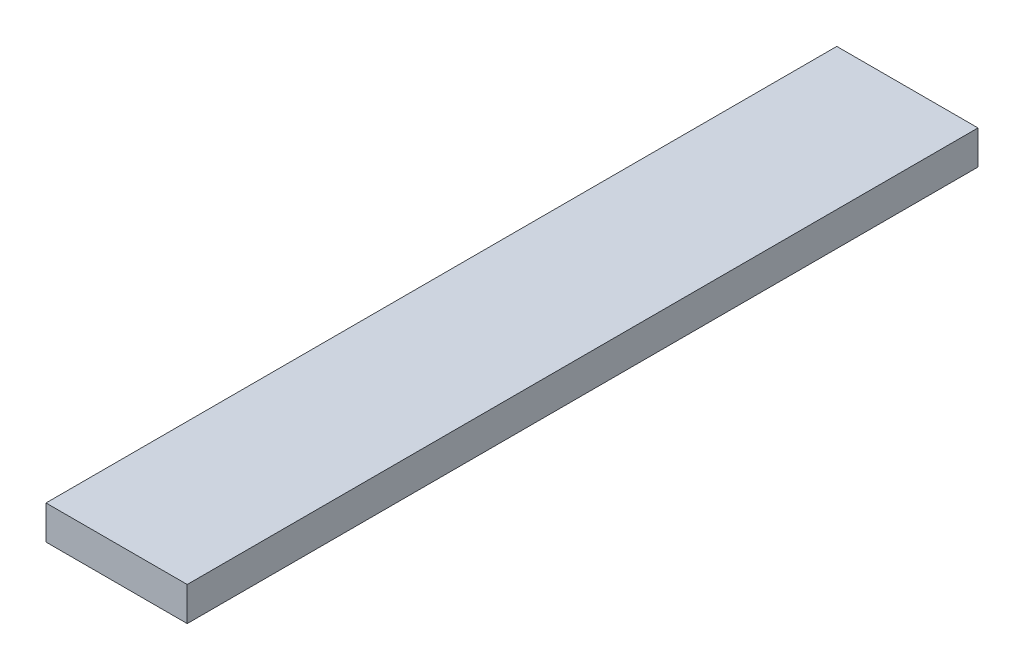
ISO-10303-21;
HEADER;
FILE_DESCRIPTION(('STEP AP214'),'2;1');
FILE_NAME('part.step','',(''),(''),'','','');
FILE_SCHEMA(('AUTOMOTIVE_DESIGN { 1 0 10303 214 1 1 1 1 }'));
ENDSEC;
DATA;
#1=APPLICATION_CONTEXT('core data for automotive mechanical design processes');
#2=APPLICATION_PROTOCOL_DEFINITION('international standard','automotive_design',2000,#1);
#3=PRODUCT_CONTEXT('',#1,'mechanical');
#4=PRODUCT('Part','Part','',(#3));
#5=PRODUCT_RELATED_PRODUCT_CATEGORY('part','',(#4));
#6=PRODUCT_DEFINITION_FORMATION('','',#4);
#7=PRODUCT_DEFINITION_CONTEXT('part definition',#1,'design');
#8=PRODUCT_DEFINITION('design','',#6,#7);
#9=PRODUCT_DEFINITION_SHAPE('','',#8);
#10=(LENGTH_UNIT() NAMED_UNIT(*) SI_UNIT(.MILLI.,.METRE.));
#11=(NAMED_UNIT(*) PLANE_ANGLE_UNIT() SI_UNIT($,.RADIAN.));
#12=(NAMED_UNIT(*) SI_UNIT($,.STERADIAN.) SOLID_ANGLE_UNIT());
#13=UNCERTAINTY_MEASURE_WITH_UNIT(LENGTH_MEASURE(1.E-05),#10,'distance_accuracy_value','');
#14=(GEOMETRIC_REPRESENTATION_CONTEXT(3) GLOBAL_UNCERTAINTY_ASSIGNED_CONTEXT((#13)) GLOBAL_UNIT_ASSIGNED_CONTEXT((#10,
#11,#12)) REPRESENTATION_CONTEXT('',''));
#15=CARTESIAN_POINT('',(0.,0.,0.));
#16=DIRECTION('',(0.,0.,1.));
#17=DIRECTION('',(1.,0.,0.));
#18=AXIS2_PLACEMENT_3D('',#15,#16,#17);
#19=CARTESIAN_POINT('',(12.5,-3.,140.));
#20=DIRECTION('',(-1.,0.,0.));
#21=DIRECTION('',(0.,0.,1.));
#22=AXIS2_PLACEMENT_3D('',#19,#20,#21);
#23=PLANE('',#22);
#24=DIRECTION('',(0.,1.,0.));
#25=VECTOR('',#24,1.);
#26=CARTESIAN_POINT('',(12.5,-3.,0.));
#27=LINE('',#26,#25);
#28=CARTESIAN_POINT('',(12.5,-3.,0.));
#29=VERTEX_POINT('',#28);
#30=CARTESIAN_POINT('',(12.5,3.,0.));
#31=VERTEX_POINT('',#30);
#32=EDGE_CURVE('E95',#29,#31,#27,.T.);
#33=ORIENTED_EDGE('',*,*,#32,.T.);
#34=DIRECTION('',(0.,0.,-1.));
#35=VECTOR('',#34,1.);
#36=CARTESIAN_POINT('',(12.5,3.,140.));
#37=LINE('',#36,#35);
#38=CARTESIAN_POINT('',(12.5,3.,140.));
#39=VERTEX_POINT('',#38);
#40=EDGE_CURVE('E11',#39,#31,#37,.T.);
#41=ORIENTED_EDGE('',*,*,#40,.F.);
#42=DIRECTION('',(0.,1.,0.));
#43=VECTOR('',#42,1.);
#44=CARTESIAN_POINT('',(12.5,-3.,140.));
#45=LINE('',#44,#43);
#46=CARTESIAN_POINT('',(12.5,-3.,140.));
#47=VERTEX_POINT('',#46);
#48=EDGE_CURVE('E83',#47,#39,#45,.T.);
#49=ORIENTED_EDGE('',*,*,#48,.F.);
#50=DIRECTION('',(0.,0.,-1.));
#51=VECTOR('',#50,1.);
#52=CARTESIAN_POINT('',(12.5,-3.,140.));
#53=LINE('',#52,#51);
#54=EDGE_CURVE('E91',#47,#29,#53,.T.);
#55=ORIENTED_EDGE('',*,*,#54,.T.);
#56=EDGE_LOOP('',(#33,#41,#49,#55));
#57=FACE_BOUND('',#56,.T.);
#58=ADVANCED_FACE('F32',(#57),#23,.F.);
#59=CARTESIAN_POINT('',(-12.5,3.,140.));
#60=DIRECTION('',(0.,-1.,0.));
#61=DIRECTION('',(0.,0.,-1.));
#62=AXIS2_PLACEMENT_3D('',#59,#60,#61);
#63=PLANE('',#62);
#64=DIRECTION('',(-1.,0.,0.));
#65=VECTOR('',#64,1.);
#66=CARTESIAN_POINT('',(-12.5,3.,0.));
#67=LINE('',#66,#65);
#68=CARTESIAN_POINT('',(-12.5,3.,0.));
#69=VERTEX_POINT('',#68);
#70=EDGE_CURVE('E87',#31,#69,#67,.T.);
#71=ORIENTED_EDGE('',*,*,#70,.T.);
#72=DIRECTION('',(0.,0.,-1.));
#73=VECTOR('',#72,1.);
#74=CARTESIAN_POINT('',(-12.5,3.,140.));
#75=LINE('',#74,#73);
#76=CARTESIAN_POINT('',(-12.5,3.,140.));
#77=VERTEX_POINT('',#76);
#78=EDGE_CURVE('E40',#77,#69,#75,.T.);
#79=ORIENTED_EDGE('',*,*,#78,.F.);
#80=DIRECTION('',(-1.,0.,0.));
#81=VECTOR('',#80,1.);
#82=CARTESIAN_POINT('',(-12.5,3.,140.));
#83=LINE('',#82,#81);
#84=EDGE_CURVE('E78',#39,#77,#83,.T.);
#85=ORIENTED_EDGE('',*,*,#84,.F.);
#86=ORIENTED_EDGE('',*,*,#40,.T.);
#87=EDGE_LOOP('',(#71,#79,#85,#86));
#88=FACE_BOUND('',#87,.T.);
#89=ADVANCED_FACE('F86',(#88),#63,.F.);
#90=CARTESIAN_POINT('',(-12.5,-3.,140.));
#91=DIRECTION('',(1.,0.,0.));
#92=DIRECTION('',(0.,0.,-1.));
#93=AXIS2_PLACEMENT_3D('',#90,#91,#92);
#94=PLANE('',#93);
#95=DIRECTION('',(0.,-1.,0.));
#96=VECTOR('',#95,1.);
#97=CARTESIAN_POINT('',(-12.5,-3.,0.));
#98=LINE('',#97,#96);
#99=CARTESIAN_POINT('',(-12.5,-3.,0.));
#100=VERTEX_POINT('',#99);
#101=EDGE_CURVE('E65',#69,#100,#98,.T.);
#102=ORIENTED_EDGE('',*,*,#101,.T.);
#103=DIRECTION('',(0.,0.,-1.));
#104=VECTOR('',#103,1.);
#105=CARTESIAN_POINT('',(-12.5,-3.,140.));
#106=LINE('',#105,#104);
#107=CARTESIAN_POINT('',(-12.5,-3.,140.));
#108=VERTEX_POINT('',#107);
#109=EDGE_CURVE('E88',#108,#100,#106,.T.);
#110=ORIENTED_EDGE('',*,*,#109,.F.);
#111=DIRECTION('',(0.,-1.,0.));
#112=VECTOR('',#111,1.);
#113=CARTESIAN_POINT('',(-12.5,-3.,140.));
#114=LINE('',#113,#112);
#115=EDGE_CURVE('E81',#77,#108,#114,.T.);
#116=ORIENTED_EDGE('',*,*,#115,.F.);
#117=ORIENTED_EDGE('',*,*,#78,.T.);
#118=EDGE_LOOP('',(#102,#110,#116,#117));
#119=FACE_BOUND('',#118,.T.);
#120=ADVANCED_FACE('F89',(#119),#94,.F.);
#121=CARTESIAN_POINT('',(-12.5,-3.,140.));
#122=DIRECTION('',(0.,1.,0.));
#123=DIRECTION('',(0.,0.,1.));
#124=AXIS2_PLACEMENT_3D('',#121,#122,#123);
#125=PLANE('',#124);
#126=DIRECTION('',(1.,0.,0.));
#127=VECTOR('',#126,1.);
#128=CARTESIAN_POINT('',(-12.5,-3.,0.));
#129=LINE('',#128,#127);
#130=EDGE_CURVE('E71',#100,#29,#129,.T.);
#131=ORIENTED_EDGE('',*,*,#130,.T.);
#132=ORIENTED_EDGE('',*,*,#54,.F.);
#133=DIRECTION('',(1.,0.,0.));
#134=VECTOR('',#133,1.);
#135=CARTESIAN_POINT('',(-12.5,-3.,140.));
#136=LINE('',#135,#134);
#137=EDGE_CURVE('E48',#108,#47,#136,.T.);
#138=ORIENTED_EDGE('',*,*,#137,.F.);
#139=ORIENTED_EDGE('',*,*,#109,.T.);
#140=EDGE_LOOP('',(#131,#132,#138,#139));
#141=FACE_BOUND('',#140,.T.);
#142=ADVANCED_FACE('F102',(#141),#125,.F.);
#143=CARTESIAN_POINT('',(0.,0.,140.));
#144=DIRECTION('',(0.,0.,-1.));
#145=DIRECTION('',(-1.,0.,0.));
#146=AXIS2_PLACEMENT_3D('',#143,#144,#145);
#147=PLANE('',#146);
#148=ORIENTED_EDGE('',*,*,#48,.T.);
#149=ORIENTED_EDGE('',*,*,#84,.T.);
#150=ORIENTED_EDGE('',*,*,#115,.T.);
#151=ORIENTED_EDGE('',*,*,#137,.T.);
#152=EDGE_LOOP('',(#148,#149,#150,#151));
#153=FACE_BOUND('',#152,.T.);
#154=ADVANCED_FACE('F79',(#153),#147,.F.);
#155=CARTESIAN_POINT('',(0.,0.,0.));
#156=DIRECTION('',(0.,0.,-1.));
#157=DIRECTION('',(-1.,0.,0.));
#158=AXIS2_PLACEMENT_3D('',#155,#156,#157);
#159=PLANE('',#158);
#160=ORIENTED_EDGE('',*,*,#32,.F.);
#161=ORIENTED_EDGE('',*,*,#130,.F.);
#162=ORIENTED_EDGE('',*,*,#101,.F.);
#163=ORIENTED_EDGE('',*,*,#70,.F.);
#164=EDGE_LOOP('',(#160,#161,#162,#163));
#165=FACE_BOUND('',#164,.T.);
#166=ADVANCED_FACE('F105',(#165),#159,.T.);
#167=CLOSED_SHELL('',(#58,#89,#120,#142,#154,#166));
#168=MANIFOLD_SOLID_BREP('B2',#167);
#169=ADVANCED_BREP_SHAPE_REPRESENTATION('',(#18,#168),#14);
#170=SHAPE_DEFINITION_REPRESENTATION(#9,#169);
ENDSEC;
END-ISO-10303-21;
